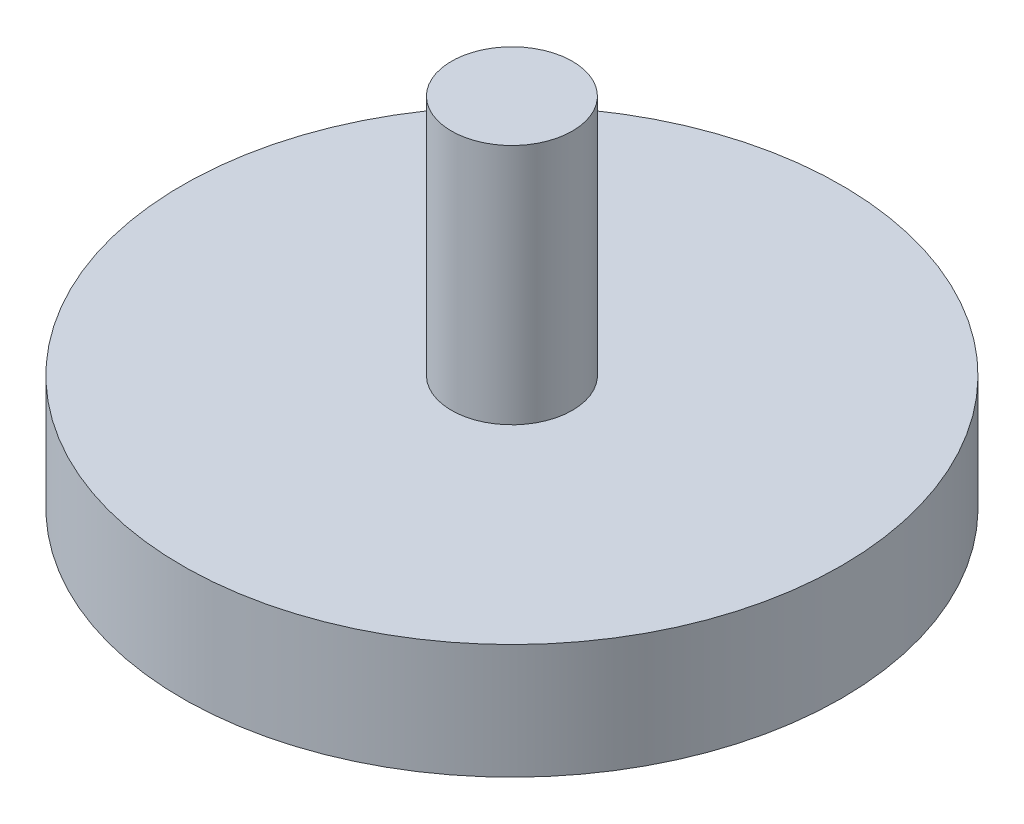
ISO-10303-21;
HEADER;
FILE_DESCRIPTION(('STEP AP214'),'2;1');
FILE_NAME('part.step','',(''),(''),'','','');
FILE_SCHEMA(('AUTOMOTIVE_DESIGN { 1 0 10303 214 1 1 1 1 }'));
ENDSEC;
DATA;
#1=APPLICATION_CONTEXT('core data for automotive mechanical design processes');
#2=APPLICATION_PROTOCOL_DEFINITION('international standard','automotive_design',2000,#1);
#3=PRODUCT_CONTEXT('',#1,'mechanical');
#4=PRODUCT('Part','Part','',(#3));
#5=PRODUCT_RELATED_PRODUCT_CATEGORY('part','',(#4));
#6=PRODUCT_DEFINITION_FORMATION('','',#4);
#7=PRODUCT_DEFINITION_CONTEXT('part definition',#1,'design');
#8=PRODUCT_DEFINITION('design','',#6,#7);
#9=PRODUCT_DEFINITION_SHAPE('','',#8);
#10=(LENGTH_UNIT() NAMED_UNIT(*) SI_UNIT(.MILLI.,.METRE.));
#11=(NAMED_UNIT(*) PLANE_ANGLE_UNIT() SI_UNIT($,.RADIAN.));
#12=(NAMED_UNIT(*) SI_UNIT($,.STERADIAN.) SOLID_ANGLE_UNIT());
#13=UNCERTAINTY_MEASURE_WITH_UNIT(LENGTH_MEASURE(1.E-05),#10,'distance_accuracy_value','');
#14=(GEOMETRIC_REPRESENTATION_CONTEXT(3) GLOBAL_UNCERTAINTY_ASSIGNED_CONTEXT((#13)) GLOBAL_UNIT_ASSIGNED_CONTEXT((#10,
#11,#12)) REPRESENTATION_CONTEXT('',''));
#15=CARTESIAN_POINT('',(0.,0.,0.));
#16=DIRECTION('',(0.,0.,1.));
#17=DIRECTION('',(1.,0.,0.));
#18=AXIS2_PLACEMENT_3D('',#15,#16,#17);
#19=CARTESIAN_POINT('',(0.,148.,0.));
#20=DIRECTION('',(0.,1.,0.));
#21=DIRECTION('',(-1.,0.,0.));
#22=AXIS2_PLACEMENT_3D('',#19,#20,#21);
#23=PLANE('',#22);
#24=CARTESIAN_POINT('',(-5.07676851835094E-13,148.,0.));
#25=DIRECTION('',(0.,-1.,0.));
#26=DIRECTION('',(1.,0.,0.));
#27=AXIS2_PLACEMENT_3D('',#24,#25,#26);
#28=CIRCLE('',#27,20.0000000000005);
#29=CARTESIAN_POINT('',(20.,148.,0.));
#30=VERTEX_POINT('',#29);
#31=EDGE_CURVE('E11',#30,#30,#28,.T.);
#32=ORIENTED_EDGE('',*,*,#31,.F.);
#33=EDGE_LOOP('',(#32));
#34=FACE_BOUND('',#33,.T.);
#35=ADVANCED_FACE('F33',(#34),#23,.T.);
#36=CARTESIAN_POINT('',(3.43024899888577E-12,-1000.,0.));
#37=DIRECTION('',(0.,-1.,0.));
#38=DIRECTION('',(1.,0.,0.));
#39=AXIS2_PLACEMENT_3D('',#36,#37,#38);
#40=CYLINDRICAL_SURFACE('',#39,20.0000000000004);
#41=ORIENTED_EDGE('',*,*,#31,.T.);
#42=EDGE_LOOP('',(#41));
#43=FACE_BOUND('',#42,.T.);
#44=CARTESIAN_POINT('',(-2.33256931924233E-13,68.0000000000001,0.));
#45=DIRECTION('',(0.,-1.,0.));
#46=DIRECTION('',(1.,0.,0.));
#47=AXIS2_PLACEMENT_3D('',#44,#45,#46);
#48=CIRCLE('',#47,20.0000000000002);
#49=CARTESIAN_POINT('',(20.,68.0000000000001,0.));
#50=VERTEX_POINT('',#49);
#51=EDGE_CURVE('E41',#50,#50,#48,.T.);
#52=ORIENTED_EDGE('',*,*,#51,.F.);
#53=EDGE_LOOP('',(#52));
#54=FACE_BOUND('',#53,.T.);
#55=ADVANCED_FACE('F188',(#43,#54),#40,.T.);
#56=CARTESIAN_POINT('',(20.,67.9999999999999,0.));
#57=DIRECTION('',(0.,1.,0.));
#58=DIRECTION('',(-1.,0.,0.));
#59=AXIS2_PLACEMENT_3D('',#56,#57,#58);
#60=PLANE('',#59);
#61=ORIENTED_EDGE('',*,*,#51,.T.);
#62=EDGE_LOOP('',(#61));
#63=FACE_BOUND('',#62,.T.);
#64=CARTESIAN_POINT('',(-2.33256931924231E-13,67.9999999999996,0.));
#65=DIRECTION('',(0.,-1.,0.));
#66=DIRECTION('',(1.,0.,0.));
#67=AXIS2_PLACEMENT_3D('',#64,#65,#66);
#68=CIRCLE('',#67,109.);
#69=CARTESIAN_POINT('',(109.,68.,0.));
#70=VERTEX_POINT('',#69);
#71=EDGE_CURVE('E138',#70,#70,#68,.T.);
#72=ORIENTED_EDGE('',*,*,#71,.F.);
#73=EDGE_LOOP('',(#72));
#74=FACE_BOUND('',#73,.T.);
#75=ADVANCED_FACE('F193',(#63,#74),#60,.T.);
#76=CARTESIAN_POINT('',(3.43024899888577E-12,-1000.,0.));
#77=DIRECTION('',(0.,-1.,0.));
#78=DIRECTION('',(1.,0.,0.));
#79=AXIS2_PLACEMENT_3D('',#76,#77,#78);
#80=CYLINDRICAL_SURFACE('',#79,109.);
#81=ORIENTED_EDGE('',*,*,#71,.T.);
#82=EDGE_LOOP('',(#81));
#83=FACE_BOUND('',#82,.T.);
#84=CARTESIAN_POINT('',(-1.02907469966572E-13,29.9999999999996,0.));
#85=DIRECTION('',(0.,-1.,0.));
#86=DIRECTION('',(1.,0.,0.));
#87=AXIS2_PLACEMENT_3D('',#84,#85,#86);
#88=CIRCLE('',#87,109.);
#89=CARTESIAN_POINT('',(109.,30.,0.));
#90=VERTEX_POINT('',#89);
#91=EDGE_CURVE('E135',#90,#90,#88,.T.);
#92=ORIENTED_EDGE('',*,*,#91,.F.);
#93=EDGE_LOOP('',(#92));
#94=FACE_BOUND('',#93,.T.);
#95=ADVANCED_FACE('F201',(#83,#94),#80,.T.);
#96=CARTESIAN_POINT('',(30.,29.9999999999999,0.));
#97=DIRECTION('',(0.,-1.,0.));
#98=DIRECTION('',(1.,0.,0.));
#99=AXIS2_PLACEMENT_3D('',#96,#97,#98);
#100=PLANE('',#99);
#101=CARTESIAN_POINT('',(0.,29.9999999999998,-38.));
#102=DIRECTION('',(0.,-1.,0.));
#103=DIRECTION('',(1.,0.,0.));
#104=AXIS2_PLACEMENT_3D('',#101,#102,#103);
#105=CIRCLE('',#104,2.74999999999999);
#106=CARTESIAN_POINT('',(2.74999999999999,29.9999999999998,-38.));
#107=VERTEX_POINT('',#106);
#108=EDGE_CURVE('E67',#107,#107,#105,.T.);
#109=ORIENTED_EDGE('',*,*,#108,.F.);
#110=EDGE_LOOP('',(#109));
#111=FACE_BOUND('',#110,.T.);
#112=CARTESIAN_POINT('',(38.,29.9999999999999,0.));
#113=DIRECTION('',(0.,-1.,0.));
#114=DIRECTION('',(1.,0.,0.));
#115=AXIS2_PLACEMENT_3D('',#112,#113,#114);
#116=CIRCLE('',#115,2.74999999999999);
#117=CARTESIAN_POINT('',(40.75,29.9999999999999,0.));
#118=VERTEX_POINT('',#117);
#119=EDGE_CURVE('E88',#118,#118,#116,.T.);
#120=ORIENTED_EDGE('',*,*,#119,.F.);
#121=EDGE_LOOP('',(#120));
#122=FACE_BOUND('',#121,.T.);
#123=CARTESIAN_POINT('',(0.,29.9999999999998,38.));
#124=DIRECTION('',(0.,-1.,0.));
#125=DIRECTION('',(1.,0.,0.));
#126=AXIS2_PLACEMENT_3D('',#123,#124,#125);
#127=CIRCLE('',#126,2.74999999999999);
#128=CARTESIAN_POINT('',(2.74999999999999,29.9999999999998,38.));
#129=VERTEX_POINT('',#128);
#130=EDGE_CURVE('E104',#129,#129,#127,.T.);
#131=ORIENTED_EDGE('',*,*,#130,.F.);
#132=EDGE_LOOP('',(#131));
#133=FACE_BOUND('',#132,.T.);
#134=CARTESIAN_POINT('',(-38.,29.9999999999996,0.));
#135=DIRECTION('',(0.,-1.,0.));
#136=DIRECTION('',(1.,0.,0.));
#137=AXIS2_PLACEMENT_3D('',#134,#135,#136);
#138=CIRCLE('',#137,2.74999999999999);
#139=CARTESIAN_POINT('',(-35.25,29.9999999999996,0.));
#140=VERTEX_POINT('',#139);
#141=EDGE_CURVE('E120',#140,#140,#138,.T.);
#142=ORIENTED_EDGE('',*,*,#141,.F.);
#143=EDGE_LOOP('',(#142));
#144=FACE_BOUND('',#143,.T.);
#145=ORIENTED_EDGE('',*,*,#91,.T.);
#146=EDGE_LOOP('',(#145));
#147=FACE_BOUND('',#146,.T.);
#148=CARTESIAN_POINT('',(-1.02907469966574E-13,30.,0.));
#149=DIRECTION('',(0.,-1.,0.));
#150=DIRECTION('',(1.,0.,0.));
#151=AXIS2_PLACEMENT_3D('',#148,#149,#150);
#152=CIRCLE('',#151,30.0000000000001);
#153=CARTESIAN_POINT('',(30.,30.0000000000001,0.));
#154=VERTEX_POINT('',#153);
#155=EDGE_CURVE('E132',#154,#154,#152,.T.);
#156=ORIENTED_EDGE('',*,*,#155,.F.);
#157=EDGE_LOOP('',(#156));
#158=FACE_BOUND('',#157,.T.);
#159=ADVANCED_FACE('F207',(#111,#122,#133,#144,#147,#158),#100,.T.);
#160=CARTESIAN_POINT('',(3.43024899888577E-12,-1000.,0.));
#161=DIRECTION('',(0.,-1.,0.));
#162=DIRECTION('',(1.,0.,0.));
#163=AXIS2_PLACEMENT_3D('',#160,#161,#162);
#164=CYLINDRICAL_SURFACE('',#163,30.0000000000001);
#165=ORIENTED_EDGE('',*,*,#155,.T.);
#166=EDGE_LOOP('',(#165));
#167=FACE_BOUND('',#166,.T.);
#168=CARTESIAN_POINT('',(0.,4.99999999999989,0.));
#169=DIRECTION('',(0.,-1.,0.));
#170=DIRECTION('',(1.,0.,0.));
#171=AXIS2_PLACEMENT_3D('',#168,#169,#170);
#172=CIRCLE('',#171,30.);
#173=CARTESIAN_POINT('',(30.,5.,0.));
#174=VERTEX_POINT('',#173);
#175=EDGE_CURVE('E129',#174,#174,#172,.T.);
#176=ORIENTED_EDGE('',*,*,#175,.F.);
#177=EDGE_LOOP('',(#176));
#178=FACE_BOUND('',#177,.T.);
#179=ADVANCED_FACE('F156',(#167,#178),#164,.T.);
#180=CARTESIAN_POINT('',(48.,5.00000000000003,0.));
#181=DIRECTION('',(0.,1.,0.));
#182=DIRECTION('',(-1.,0.,0.));
#183=AXIS2_PLACEMENT_3D('',#180,#181,#182);
#184=PLANE('',#183);
#185=CARTESIAN_POINT('',(0.,4.99999999999986,-38.));
#186=DIRECTION('',(0.,1.,0.));
#187=DIRECTION('',(-1.,0.,0.));
#188=AXIS2_PLACEMENT_3D('',#185,#186,#187);
#189=CIRCLE('',#188,2.74999999999999);
#190=CARTESIAN_POINT('',(-2.74999999999999,4.99999999999985,-38.));
#191=VERTEX_POINT('',#190);
#192=EDGE_CURVE('E36',#191,#191,#189,.T.);
#193=ORIENTED_EDGE('',*,*,#192,.F.);
#194=EDGE_LOOP('',(#193));
#195=FACE_BOUND('',#194,.T.);
#196=CARTESIAN_POINT('',(38.,4.99999999999999,0.));
#197=DIRECTION('',(0.,1.,0.));
#198=DIRECTION('',(-1.,0.,0.));
#199=AXIS2_PLACEMENT_3D('',#196,#197,#198);
#200=CIRCLE('',#199,2.74999999999999);
#201=CARTESIAN_POINT('',(35.25,4.99999999999998,0.));
#202=VERTEX_POINT('',#201);
#203=EDGE_CURVE('E87',#202,#202,#200,.T.);
#204=ORIENTED_EDGE('',*,*,#203,.F.);
#205=EDGE_LOOP('',(#204));
#206=FACE_BOUND('',#205,.T.);
#207=CARTESIAN_POINT('',(0.,4.99999999999986,38.));
#208=DIRECTION('',(0.,1.,0.));
#209=DIRECTION('',(-1.,0.,0.));
#210=AXIS2_PLACEMENT_3D('',#207,#208,#209);
#211=CIRCLE('',#210,2.74999999999999);
#212=CARTESIAN_POINT('',(-2.74999999999999,4.99999999999985,38.));
#213=VERTEX_POINT('',#212);
#214=EDGE_CURVE('E103',#213,#213,#211,.T.);
#215=ORIENTED_EDGE('',*,*,#214,.F.);
#216=EDGE_LOOP('',(#215));
#217=FACE_BOUND('',#216,.T.);
#218=CARTESIAN_POINT('',(-38.,4.99999999999973,0.));
#219=DIRECTION('',(0.,1.,0.));
#220=DIRECTION('',(-1.,0.,0.));
#221=AXIS2_PLACEMENT_3D('',#218,#219,#220);
#222=CIRCLE('',#221,2.74999999999999);
#223=CARTESIAN_POINT('',(-40.75,4.99999999999972,0.));
#224=VERTEX_POINT('',#223);
#225=EDGE_CURVE('E119',#224,#224,#222,.T.);
#226=ORIENTED_EDGE('',*,*,#225,.F.);
#227=EDGE_LOOP('',(#226));
#228=FACE_BOUND('',#227,.T.);
#229=ORIENTED_EDGE('',*,*,#175,.T.);
#230=EDGE_LOOP('',(#229));
#231=FACE_BOUND('',#230,.T.);
#232=CARTESIAN_POINT('',(0.,4.99999999999967,0.));
#233=DIRECTION('',(0.,-1.,0.));
#234=DIRECTION('',(1.,0.,0.));
#235=AXIS2_PLACEMENT_3D('',#232,#233,#234);
#236=CIRCLE('',#235,48.);
#237=CARTESIAN_POINT('',(48.,4.99999999999984,0.));
#238=VERTEX_POINT('',#237);
#239=EDGE_CURVE('E126',#238,#238,#236,.T.);
#240=ORIENTED_EDGE('',*,*,#239,.F.);
#241=EDGE_LOOP('',(#240));
#242=FACE_BOUND('',#241,.T.);
#243=ADVANCED_FACE('F152',(#195,#206,#217,#228,#231,#242),#184,.T.);
#244=CARTESIAN_POINT('',(3.43024899888577E-12,-1000.,0.));
#245=DIRECTION('',(0.,-1.,0.));
#246=DIRECTION('',(1.,0.,0.));
#247=AXIS2_PLACEMENT_3D('',#244,#245,#246);
#248=CYLINDRICAL_SURFACE('',#247,48.);
#249=ORIENTED_EDGE('',*,*,#239,.T.);
#250=EDGE_LOOP('',(#249));
#251=FACE_BOUND('',#250,.T.);
#252=CARTESIAN_POINT('',(0.,-1.11022302462516E-13,0.));
#253=DIRECTION('',(0.,-1.,0.));
#254=DIRECTION('',(1.,0.,0.));
#255=AXIS2_PLACEMENT_3D('',#252,#253,#254);
#256=CIRCLE('',#255,48.);
#257=CARTESIAN_POINT('',(48.,0.,0.));
#258=VERTEX_POINT('',#257);
#259=EDGE_CURVE('E123',#258,#258,#256,.T.);
#260=ORIENTED_EDGE('',*,*,#259,.F.);
#261=EDGE_LOOP('',(#260));
#262=FACE_BOUND('',#261,.T.);
#263=ADVANCED_FACE('F155',(#251,#262),#248,.T.);
#264=CARTESIAN_POINT('',(0.,0.,0.));
#265=DIRECTION('',(0.,-1.,0.));
#266=DIRECTION('',(1.,0.,0.));
#267=AXIS2_PLACEMENT_3D('',#264,#265,#266);
#268=PLANE('',#267);
#269=CARTESIAN_POINT('',(0.,0.,-38.));
#270=DIRECTION('',(0.,-1.,0.));
#271=DIRECTION('',(0.,0.,-1.));
#272=AXIS2_PLACEMENT_3D('',#269,#270,#271);
#273=CIRCLE('',#272,6.119);
#274=CARTESIAN_POINT('',(0.,0.,-44.119));
#275=VERTEX_POINT('',#274);
#276=EDGE_CURVE('E470',#275,#275,#273,.T.);
#277=ORIENTED_EDGE('',*,*,#276,.F.);
#278=EDGE_LOOP('',(#277));
#279=FACE_BOUND('',#278,.T.);
#280=CARTESIAN_POINT('',(38.,1.30349461957659E-13,0.));
#281=DIRECTION('',(0.,-1.,0.));
#282=DIRECTION('',(0.,0.,-1.));
#283=AXIS2_PLACEMENT_3D('',#280,#281,#282);
#284=CIRCLE('',#283,6.11899999999999);
#285=CARTESIAN_POINT('',(38.,1.30349461957659E-13,-6.11899999999999));
#286=VERTEX_POINT('',#285);
#287=EDGE_CURVE('E75',#286,#286,#284,.T.);
#288=ORIENTED_EDGE('',*,*,#287,.F.);
#289=EDGE_LOOP('',(#288));
#290=FACE_BOUND('',#289,.T.);
#291=CARTESIAN_POINT('',(0.,0.,38.));
#292=DIRECTION('',(0.,-1.,0.));
#293=DIRECTION('',(0.,0.,-1.));
#294=AXIS2_PLACEMENT_3D('',#291,#292,#293);
#295=CIRCLE('',#294,6.119);
#296=CARTESIAN_POINT('',(0.,0.,31.881));
#297=VERTEX_POINT('',#296);
#298=EDGE_CURVE('E91',#297,#297,#295,.T.);
#299=ORIENTED_EDGE('',*,*,#298,.F.);
#300=EDGE_LOOP('',(#299));
#301=FACE_BOUND('',#300,.T.);
#302=CARTESIAN_POINT('',(-38.,-1.30349461957659E-13,0.));
#303=DIRECTION('',(0.,-1.,0.));
#304=DIRECTION('',(0.,0.,-1.));
#305=AXIS2_PLACEMENT_3D('',#302,#303,#304);
#306=CIRCLE('',#305,6.11899999999999);
#307=CARTESIAN_POINT('',(-38.,-1.30349461957659E-13,-6.11899999999999));
#308=VERTEX_POINT('',#307);
#309=EDGE_CURVE('E107',#308,#308,#306,.T.);
#310=ORIENTED_EDGE('',*,*,#309,.F.);
#311=EDGE_LOOP('',(#310));
#312=FACE_BOUND('',#311,.T.);
#313=ORIENTED_EDGE('',*,*,#259,.T.);
#314=EDGE_LOOP('',(#313));
#315=FACE_BOUND('',#314,.T.);
#316=ADVANCED_FACE('F169',(#279,#290,#301,#312,#315),#268,.T.);
#317=CARTESIAN_POINT('',(-38.,-1.30349461957659E-13,0.));
#318=DIRECTION('',(0.,-1.,0.));
#319=DIRECTION('',(0.,0.,-1.));
#320=AXIS2_PLACEMENT_3D('',#317,#318,#319);
#321=CYLINDRICAL_SURFACE('',#320,2.74999999999999);
#322=ORIENTED_EDGE('',*,*,#225,.T.);
#323=EDGE_LOOP('',(#322));
#324=FACE_BOUND('',#323,.T.);
#325=CARTESIAN_POINT('',(-38.,3.49999999999987,0.));
#326=DIRECTION('',(0.,-1.,0.));
#327=DIRECTION('',(0.,0.,-1.));
#328=AXIS2_PLACEMENT_3D('',#325,#326,#327);
#329=CIRCLE('',#328,2.75);
#330=CARTESIAN_POINT('',(-38.,3.49999999999987,-2.75));
#331=VERTEX_POINT('',#330);
#332=EDGE_CURVE('E113',#331,#331,#329,.T.);
#333=ORIENTED_EDGE('',*,*,#332,.T.);
#334=EDGE_LOOP('',(#333));
#335=FACE_BOUND('',#334,.T.);
#336=ADVANCED_FACE('F174',(#324,#335),#321,.F.);
#337=CARTESIAN_POINT('',(-35.25,3.49999999999987,0.));
#338=DIRECTION('',(0.,1.,0.));
#339=DIRECTION('',(0.,0.,1.));
#340=AXIS2_PLACEMENT_3D('',#337,#338,#339);
#341=PLANE('',#340);
#342=ORIENTED_EDGE('',*,*,#332,.F.);
#343=EDGE_LOOP('',(#342));
#344=FACE_BOUND('',#343,.T.);
#345=CARTESIAN_POINT('',(-38.,3.49999999999987,0.));
#346=DIRECTION('',(0.,-1.,0.));
#347=DIRECTION('',(0.,0.,-1.));
#348=AXIS2_PLACEMENT_3D('',#345,#346,#347);
#349=CIRCLE('',#348,6.119);
#350=CARTESIAN_POINT('',(-38.,3.49999999999987,-6.119));
#351=VERTEX_POINT('',#350);
#352=EDGE_CURVE('E110',#351,#351,#349,.T.);
#353=ORIENTED_EDGE('',*,*,#352,.T.);
#354=EDGE_LOOP('',(#353));
#355=FACE_BOUND('',#354,.T.);
#356=ADVANCED_FACE('F180',(#344,#355),#341,.F.);
#357=CARTESIAN_POINT('',(-38.,-1.30349461957659E-13,0.));
#358=DIRECTION('',(0.,-1.,0.));
#359=DIRECTION('',(0.,0.,-1.));
#360=AXIS2_PLACEMENT_3D('',#357,#358,#359);
#361=CYLINDRICAL_SURFACE('',#360,6.119);
#362=ORIENTED_EDGE('',*,*,#352,.F.);
#363=EDGE_LOOP('',(#362));
#364=FACE_BOUND('',#363,.T.);
#365=ORIENTED_EDGE('',*,*,#309,.T.);
#366=EDGE_LOOP('',(#365));
#367=FACE_BOUND('',#366,.T.);
#368=ADVANCED_FACE('F281',(#364,#367),#361,.F.);
#369=ORIENTED_EDGE('',*,*,#141,.T.);
#370=EDGE_LOOP('',(#369));
#371=FACE_BOUND('',#370,.T.);
#372=CARTESIAN_POINT('',(-38.,47.9999999999999,0.));
#373=DIRECTION('',(0.,-1.,0.));
#374=DIRECTION('',(0.,0.,-1.));
#375=AXIS2_PLACEMENT_3D('',#372,#373,#374);
#376=CIRCLE('',#375,2.74999999999999);
#377=CARTESIAN_POINT('',(-38.,47.9999999999999,-2.74999999999999));
#378=VERTEX_POINT('',#377);
#379=EDGE_CURVE('E116',#378,#378,#376,.T.);
#380=ORIENTED_EDGE('',*,*,#379,.F.);
#381=EDGE_LOOP('',(#380));
#382=FACE_BOUND('',#381,.T.);
#383=ADVANCED_FACE('F183',(#371,#382),#321,.F.);
#384=CARTESIAN_POINT('',(-38.,47.9999999999999,0.));
#385=DIRECTION('',(0.,-1.,0.));
#386=DIRECTION('',(0.,0.,-1.));
#387=AXIS2_PLACEMENT_3D('',#384,#385,#386);
#388=CONICAL_SURFACE('',#387,2.74999999999999,1.02974425867665);
#389=CARTESIAN_POINT('',(-38.,49.6523667023257,0.));
#390=VERTEX_POINT('',#389);
#391=VERTEX_LOOP('',#390);
#392=FACE_BOUND('',#391,.T.);
#393=ORIENTED_EDGE('',*,*,#379,.T.);
#394=EDGE_LOOP('',(#393));
#395=FACE_BOUND('',#394,.T.);
#396=ADVANCED_FACE('F298',(#392,#395),#388,.F.);
#397=CARTESIAN_POINT('',(0.,0.,38.));
#398=DIRECTION('',(0.,-1.,0.));
#399=DIRECTION('',(0.,0.,-1.));
#400=AXIS2_PLACEMENT_3D('',#397,#398,#399);
#401=CYLINDRICAL_SURFACE('',#400,2.74999999999999);
#402=ORIENTED_EDGE('',*,*,#214,.T.);
#403=EDGE_LOOP('',(#402));
#404=FACE_BOUND('',#403,.T.);
#405=CARTESIAN_POINT('',(0.,3.5,38.));
#406=DIRECTION('',(0.,-1.,0.));
#407=DIRECTION('',(0.,0.,-1.));
#408=AXIS2_PLACEMENT_3D('',#405,#406,#407);
#409=CIRCLE('',#408,2.74999999999999);
#410=CARTESIAN_POINT('',(0.,3.5,35.25));
#411=VERTEX_POINT('',#410);
#412=EDGE_CURVE('E97',#411,#411,#409,.T.);
#413=ORIENTED_EDGE('',*,*,#412,.T.);
#414=EDGE_LOOP('',(#413));
#415=FACE_BOUND('',#414,.T.);
#416=ADVANCED_FACE('F306',(#404,#415),#401,.F.);
#417=CARTESIAN_POINT('',(2.74999999999999,3.5,38.));
#418=DIRECTION('',(0.,1.,0.));
#419=DIRECTION('',(0.,0.,1.));
#420=AXIS2_PLACEMENT_3D('',#417,#418,#419);
#421=PLANE('',#420);
#422=ORIENTED_EDGE('',*,*,#412,.F.);
#423=EDGE_LOOP('',(#422));
#424=FACE_BOUND('',#423,.T.);
#425=CARTESIAN_POINT('',(0.,3.5,38.));
#426=DIRECTION('',(0.,-1.,0.));
#427=DIRECTION('',(0.,0.,-1.));
#428=AXIS2_PLACEMENT_3D('',#425,#426,#427);
#429=CIRCLE('',#428,6.119);
#430=CARTESIAN_POINT('',(0.,3.5,31.881));
#431=VERTEX_POINT('',#430);
#432=EDGE_CURVE('E94',#431,#431,#429,.T.);
#433=ORIENTED_EDGE('',*,*,#432,.T.);
#434=EDGE_LOOP('',(#433));
#435=FACE_BOUND('',#434,.T.);
#436=ADVANCED_FACE('F313',(#424,#435),#421,.F.);
#437=CARTESIAN_POINT('',(0.,0.,38.));
#438=DIRECTION('',(0.,-1.,0.));
#439=DIRECTION('',(0.,0.,-1.));
#440=AXIS2_PLACEMENT_3D('',#437,#438,#439);
#441=CYLINDRICAL_SURFACE('',#440,6.119);
#442=ORIENTED_EDGE('',*,*,#432,.F.);
#443=EDGE_LOOP('',(#442));
#444=FACE_BOUND('',#443,.T.);
#445=ORIENTED_EDGE('',*,*,#298,.T.);
#446=EDGE_LOOP('',(#445));
#447=FACE_BOUND('',#446,.T.);
#448=ADVANCED_FACE('F323',(#444,#447),#441,.F.);
#449=ORIENTED_EDGE('',*,*,#130,.T.);
#450=EDGE_LOOP('',(#449));
#451=FACE_BOUND('',#450,.T.);
#452=CARTESIAN_POINT('',(0.,48.0000000000001,38.));
#453=DIRECTION('',(0.,-1.,0.));
#454=DIRECTION('',(0.,0.,-1.));
#455=AXIS2_PLACEMENT_3D('',#452,#453,#454);
#456=CIRCLE('',#455,2.74999999999999);
#457=CARTESIAN_POINT('',(0.,48.0000000000001,35.25));
#458=VERTEX_POINT('',#457);
#459=EDGE_CURVE('E100',#458,#458,#456,.T.);
#460=ORIENTED_EDGE('',*,*,#459,.F.);
#461=EDGE_LOOP('',(#460));
#462=FACE_BOUND('',#461,.T.);
#463=ADVANCED_FACE('F316',(#451,#462),#401,.F.);
#464=CARTESIAN_POINT('',(0.,48.0000000000001,38.));
#465=DIRECTION('',(0.,-1.,0.));
#466=DIRECTION('',(0.,0.,-1.));
#467=AXIS2_PLACEMENT_3D('',#464,#465,#466);
#468=CONICAL_SURFACE('',#467,2.74999999999999,1.02974425867665);
#469=CARTESIAN_POINT('',(0.,49.6523667023259,38.));
#470=VERTEX_POINT('',#469);
#471=VERTEX_LOOP('',#470);
#472=FACE_BOUND('',#471,.T.);
#473=ORIENTED_EDGE('',*,*,#459,.T.);
#474=EDGE_LOOP('',(#473));
#475=FACE_BOUND('',#474,.T.);
#476=ADVANCED_FACE('F340',(#472,#475),#468,.F.);
#477=CARTESIAN_POINT('',(38.,1.30349461957659E-13,0.));
#478=DIRECTION('',(0.,-1.,0.));
#479=DIRECTION('',(0.,0.,-1.));
#480=AXIS2_PLACEMENT_3D('',#477,#478,#479);
#481=CYLINDRICAL_SURFACE('',#480,2.74999999999999);
#482=ORIENTED_EDGE('',*,*,#203,.T.);
#483=EDGE_LOOP('',(#482));
#484=FACE_BOUND('',#483,.T.);
#485=CARTESIAN_POINT('',(38.,3.50000000000013,0.));
#486=DIRECTION('',(0.,-1.,0.));
#487=DIRECTION('',(0.,0.,-1.));
#488=AXIS2_PLACEMENT_3D('',#485,#486,#487);
#489=CIRCLE('',#488,2.75);
#490=CARTESIAN_POINT('',(38.,3.50000000000013,-2.75));
#491=VERTEX_POINT('',#490);
#492=EDGE_CURVE('E81',#491,#491,#489,.T.);
#493=ORIENTED_EDGE('',*,*,#492,.T.);
#494=EDGE_LOOP('',(#493));
#495=FACE_BOUND('',#494,.T.);
#496=ADVANCED_FACE('F149',(#484,#495),#481,.F.);
#497=CARTESIAN_POINT('',(40.75,3.50000000000013,0.));
#498=DIRECTION('',(0.,1.,0.));
#499=DIRECTION('',(0.,0.,1.));
#500=AXIS2_PLACEMENT_3D('',#497,#498,#499);
#501=PLANE('',#500);
#502=ORIENTED_EDGE('',*,*,#492,.F.);
#503=EDGE_LOOP('',(#502));
#504=FACE_BOUND('',#503,.T.);
#505=CARTESIAN_POINT('',(38.,3.50000000000013,0.));
#506=DIRECTION('',(0.,-1.,0.));
#507=DIRECTION('',(0.,0.,-1.));
#508=AXIS2_PLACEMENT_3D('',#505,#506,#507);
#509=CIRCLE('',#508,6.119);
#510=CARTESIAN_POINT('',(38.,3.50000000000013,-6.119));
#511=VERTEX_POINT('',#510);
#512=EDGE_CURVE('E78',#511,#511,#509,.T.);
#513=ORIENTED_EDGE('',*,*,#512,.T.);
#514=EDGE_LOOP('',(#513));
#515=FACE_BOUND('',#514,.T.);
#516=ADVANCED_FACE('F355',(#504,#515),#501,.F.);
#517=CARTESIAN_POINT('',(38.,1.30349461957659E-13,0.));
#518=DIRECTION('',(0.,-1.,0.));
#519=DIRECTION('',(0.,0.,-1.));
#520=AXIS2_PLACEMENT_3D('',#517,#518,#519);
#521=CYLINDRICAL_SURFACE('',#520,6.119);
#522=ORIENTED_EDGE('',*,*,#512,.F.);
#523=EDGE_LOOP('',(#522));
#524=FACE_BOUND('',#523,.T.);
#525=ORIENTED_EDGE('',*,*,#287,.T.);
#526=EDGE_LOOP('',(#525));
#527=FACE_BOUND('',#526,.T.);
#528=ADVANCED_FACE('F364',(#524,#527),#521,.F.);
#529=ORIENTED_EDGE('',*,*,#119,.T.);
#530=EDGE_LOOP('',(#529));
#531=FACE_BOUND('',#530,.T.);
#532=CARTESIAN_POINT('',(38.,48.0000000000002,0.));
#533=DIRECTION('',(0.,-1.,0.));
#534=DIRECTION('',(0.,0.,-1.));
#535=AXIS2_PLACEMENT_3D('',#532,#533,#534);
#536=CIRCLE('',#535,2.74999999999999);
#537=CARTESIAN_POINT('',(38.,48.0000000000002,-2.74999999999999));
#538=VERTEX_POINT('',#537);
#539=EDGE_CURVE('E84',#538,#538,#536,.T.);
#540=ORIENTED_EDGE('',*,*,#539,.F.);
#541=EDGE_LOOP('',(#540));
#542=FACE_BOUND('',#541,.T.);
#543=ADVANCED_FACE('F357',(#531,#542),#481,.F.);
#544=CARTESIAN_POINT('',(38.,48.0000000000002,0.));
#545=DIRECTION('',(0.,-1.,0.));
#546=DIRECTION('',(0.,0.,-1.));
#547=AXIS2_PLACEMENT_3D('',#544,#545,#546);
#548=CONICAL_SURFACE('',#547,2.74999999999999,1.02974425867665);
#549=CARTESIAN_POINT('',(38.,49.652366702326,0.));
#550=VERTEX_POINT('',#549);
#551=VERTEX_LOOP('',#550);
#552=FACE_BOUND('',#551,.T.);
#553=ORIENTED_EDGE('',*,*,#539,.T.);
#554=EDGE_LOOP('',(#553));
#555=FACE_BOUND('',#554,.T.);
#556=ADVANCED_FACE('F381',(#552,#555),#548,.F.);
#557=CARTESIAN_POINT('',(0.,0.,-38.));
#558=DIRECTION('',(0.,-1.,0.));
#559=DIRECTION('',(0.,0.,-1.));
#560=AXIS2_PLACEMENT_3D('',#557,#558,#559);
#561=CYLINDRICAL_SURFACE('',#560,2.74999999999999);
#562=ORIENTED_EDGE('',*,*,#192,.T.);
#563=EDGE_LOOP('',(#562));
#564=FACE_BOUND('',#563,.T.);
#565=CARTESIAN_POINT('',(0.,3.5,-38.));
#566=DIRECTION('',(0.,-1.,0.));
#567=DIRECTION('',(0.,0.,-1.));
#568=AXIS2_PLACEMENT_3D('',#565,#566,#567);
#569=CIRCLE('',#568,2.74999999999999);
#570=CARTESIAN_POINT('',(0.,3.5,-40.75));
#571=VERTEX_POINT('',#570);
#572=EDGE_CURVE('E64',#571,#571,#569,.T.);
#573=ORIENTED_EDGE('',*,*,#572,.T.);
#574=EDGE_LOOP('',(#573));
#575=FACE_BOUND('',#574,.T.);
#576=ADVANCED_FACE('F389',(#564,#575),#561,.F.);
#577=CARTESIAN_POINT('',(2.74999999999999,3.5,-38.));
#578=DIRECTION('',(0.,1.,0.));
#579=DIRECTION('',(0.,0.,1.));
#580=AXIS2_PLACEMENT_3D('',#577,#578,#579);
#581=PLANE('',#580);
#582=ORIENTED_EDGE('',*,*,#572,.F.);
#583=EDGE_LOOP('',(#582));
#584=FACE_BOUND('',#583,.T.);
#585=CARTESIAN_POINT('',(0.,3.5,-38.));
#586=DIRECTION('',(0.,-1.,0.));
#587=DIRECTION('',(0.,0.,-1.));
#588=AXIS2_PLACEMENT_3D('',#585,#586,#587);
#589=CIRCLE('',#588,6.119);
#590=CARTESIAN_POINT('',(0.,3.5,-44.119));
#591=VERTEX_POINT('',#590);
#592=EDGE_CURVE('E69',#591,#591,#589,.T.);
#593=ORIENTED_EDGE('',*,*,#592,.T.);
#594=EDGE_LOOP('',(#593));
#595=FACE_BOUND('',#594,.T.);
#596=ADVANCED_FACE('F398',(#584,#595),#581,.F.);
#597=CARTESIAN_POINT('',(0.,0.,-38.));
#598=DIRECTION('',(0.,-1.,0.));
#599=DIRECTION('',(0.,0.,-1.));
#600=AXIS2_PLACEMENT_3D('',#597,#598,#599);
#601=CYLINDRICAL_SURFACE('',#600,6.119);
#602=ORIENTED_EDGE('',*,*,#592,.F.);
#603=EDGE_LOOP('',(#602));
#604=FACE_BOUND('',#603,.T.);
#605=ORIENTED_EDGE('',*,*,#276,.T.);
#606=EDGE_LOOP('',(#605));
#607=FACE_BOUND('',#606,.T.);
#608=ADVANCED_FACE('F407',(#604,#607),#601,.F.);
#609=ORIENTED_EDGE('',*,*,#108,.T.);
#610=EDGE_LOOP('',(#609));
#611=FACE_BOUND('',#610,.T.);
#612=CARTESIAN_POINT('',(0.,48.0000000000001,-38.));
#613=DIRECTION('',(0.,-1.,0.));
#614=DIRECTION('',(0.,0.,-1.));
#615=AXIS2_PLACEMENT_3D('',#612,#613,#614);
#616=CIRCLE('',#615,2.74999999999999);
#617=CARTESIAN_POINT('',(0.,48.0000000000001,-40.75));
#618=VERTEX_POINT('',#617);
#619=EDGE_CURVE('E62',#618,#618,#616,.T.);
#620=ORIENTED_EDGE('',*,*,#619,.F.);
#621=EDGE_LOOP('',(#620));
#622=FACE_BOUND('',#621,.T.);
#623=ADVANCED_FACE('F58',(#611,#622),#561,.F.);
#624=CARTESIAN_POINT('',(0.,48.0000000000001,-38.));
#625=DIRECTION('',(0.,-1.,0.));
#626=DIRECTION('',(0.,0.,-1.));
#627=AXIS2_PLACEMENT_3D('',#624,#625,#626);
#628=CONICAL_SURFACE('',#627,2.74999999999999,1.02974425867665);
#629=CARTESIAN_POINT('',(0.,49.6523667023259,-38.));
#630=VERTEX_POINT('',#629);
#631=VERTEX_LOOP('',#630);
#632=FACE_BOUND('',#631,.T.);
#633=ORIENTED_EDGE('',*,*,#619,.T.);
#634=EDGE_LOOP('',(#633));
#635=FACE_BOUND('',#634,.T.);
#636=ADVANCED_FACE('F55',(#632,#635),#628,.F.);
#637=CLOSED_SHELL('',(#35,#55,#75,#95,#159,#179,#243,#263,#316,#336,#356,#368,#383,#396,#416,
#436,#448,#463,#476,#496,#516,#528,#543,#556,#576,#596,#608,#623,#636));
#638=MANIFOLD_SOLID_BREP('B2',#637);
#639=ADVANCED_BREP_SHAPE_REPRESENTATION('',(#18,#638),#14);
#640=SHAPE_DEFINITION_REPRESENTATION(#9,#639);
ENDSEC;
END-ISO-10303-21;
